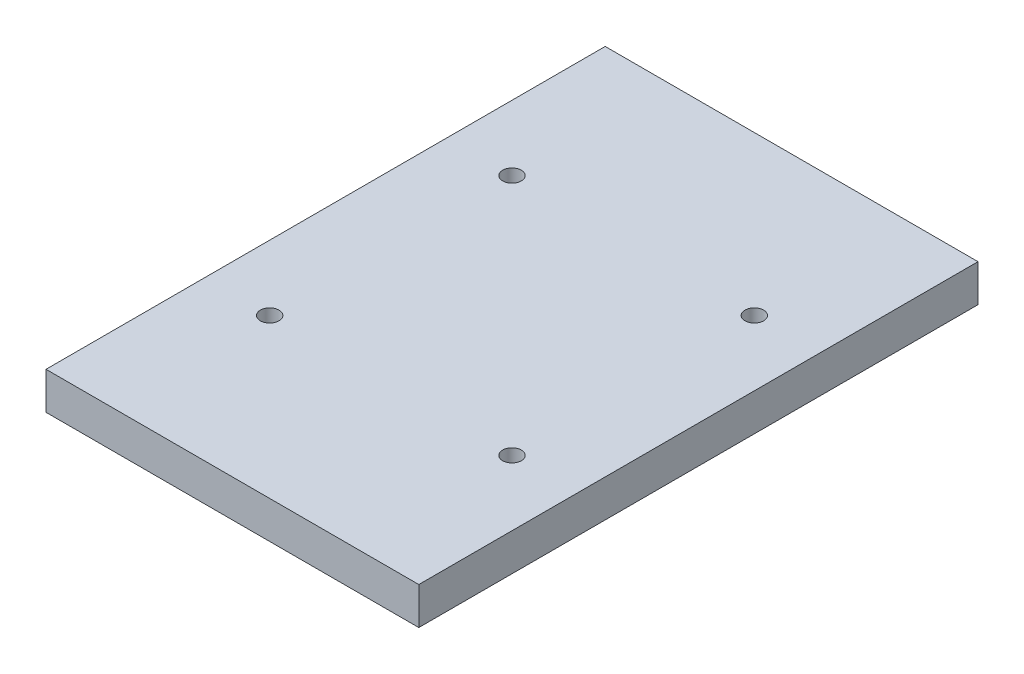
ISO-10303-21;
HEADER;
FILE_DESCRIPTION(('STEP AP214'),'2;1');
FILE_NAME('part.step','',(''),(''),'','','');
FILE_SCHEMA(('AUTOMOTIVE_DESIGN { 1 0 10303 214 1 1 1 1 }'));
ENDSEC;
DATA;
#1=APPLICATION_CONTEXT('core data for automotive mechanical design processes');
#2=APPLICATION_PROTOCOL_DEFINITION('international standard','automotive_design',2000,#1);
#3=PRODUCT_CONTEXT('',#1,'mechanical');
#4=PRODUCT('Part','Part','',(#3));
#5=PRODUCT_RELATED_PRODUCT_CATEGORY('part','',(#4));
#6=PRODUCT_DEFINITION_FORMATION('','',#4);
#7=PRODUCT_DEFINITION_CONTEXT('part definition',#1,'design');
#8=PRODUCT_DEFINITION('design','',#6,#7);
#9=PRODUCT_DEFINITION_SHAPE('','',#8);
#10=(LENGTH_UNIT() NAMED_UNIT(*) SI_UNIT(.MILLI.,.METRE.));
#11=(NAMED_UNIT(*) PLANE_ANGLE_UNIT() SI_UNIT($,.RADIAN.));
#12=(NAMED_UNIT(*) SI_UNIT($,.STERADIAN.) SOLID_ANGLE_UNIT());
#13=UNCERTAINTY_MEASURE_WITH_UNIT(LENGTH_MEASURE(1.E-05),#10,'distance_accuracy_value','');
#14=(GEOMETRIC_REPRESENTATION_CONTEXT(3) GLOBAL_UNCERTAINTY_ASSIGNED_CONTEXT((#13)) GLOBAL_UNIT_ASSIGNED_CONTEXT((#10,
#11,#12)) REPRESENTATION_CONTEXT('',''));
#15=CARTESIAN_POINT('',(0.,0.,0.));
#16=DIRECTION('',(0.,0.,1.));
#17=DIRECTION('',(1.,0.,0.));
#18=AXIS2_PLACEMENT_3D('',#15,#16,#17);
#19=CARTESIAN_POINT('',(0.,-120.,0.));
#20=DIRECTION('',(0.,1.,0.));
#21=DIRECTION('',(0.,0.,1.));
#22=AXIS2_PLACEMENT_3D('',#19,#20,#21);
#23=PLANE('',#22);
#24=CARTESIAN_POINT('',(462.5,-120.,-242.5));
#25=DIRECTION('',(0.,1.,0.));
#26=DIRECTION('',(0.,0.,1.));
#27=AXIS2_PLACEMENT_3D('',#24,#25,#26);
#28=CIRCLE('',#27,2.5);
#29=CARTESIAN_POINT('',(462.5,-120.,-240.));
#30=VERTEX_POINT('',#29);
#31=EDGE_CURVE('E136',#30,#30,#28,.T.);
#32=ORIENTED_EDGE('',*,*,#31,.F.);
#33=EDGE_LOOP('',(#32));
#34=FACE_BOUND('',#33,.T.);
#35=CARTESIAN_POINT('',(397.5,-120.,-242.5));
#36=DIRECTION('',(0.,1.,0.));
#37=DIRECTION('',(0.,0.,1.));
#38=AXIS2_PLACEMENT_3D('',#35,#36,#37);
#39=CIRCLE('',#38,2.5);
#40=CARTESIAN_POINT('',(397.5,-120.,-240.));
#41=VERTEX_POINT('',#40);
#42=EDGE_CURVE('E130',#41,#41,#39,.T.);
#43=ORIENTED_EDGE('',*,*,#42,.F.);
#44=EDGE_LOOP('',(#43));
#45=FACE_BOUND('',#44,.T.);
#46=CARTESIAN_POINT('',(397.5,-120.,-177.5));
#47=DIRECTION('',(0.,1.,0.));
#48=DIRECTION('',(0.,0.,1.));
#49=AXIS2_PLACEMENT_3D('',#46,#47,#48);
#50=CIRCLE('',#49,2.5);
#51=CARTESIAN_POINT('',(397.5,-120.,-175.));
#52=VERTEX_POINT('',#51);
#53=EDGE_CURVE('E124',#52,#52,#50,.T.);
#54=ORIENTED_EDGE('',*,*,#53,.F.);
#55=EDGE_LOOP('',(#54));
#56=FACE_BOUND('',#55,.T.);
#57=CARTESIAN_POINT('',(462.5,-120.,-177.5));
#58=DIRECTION('',(0.,1.,0.));
#59=DIRECTION('',(0.,0.,1.));
#60=AXIS2_PLACEMENT_3D('',#57,#58,#59);
#61=CIRCLE('',#60,2.5);
#62=CARTESIAN_POINT('',(462.5,-120.,-175.));
#63=VERTEX_POINT('',#62);
#64=EDGE_CURVE('E109',#63,#63,#61,.T.);
#65=ORIENTED_EDGE('',*,*,#64,.F.);
#66=EDGE_LOOP('',(#65));
#67=FACE_BOUND('',#66,.T.);
#68=DIRECTION('',(0.,0.,-1.));
#69=VECTOR('',#68,1.);
#70=CARTESIAN_POINT('',(380.,-120.,-285.));
#71=LINE('',#70,#69);
#72=CARTESIAN_POINT('',(380.,-120.,-135.));
#73=VERTEX_POINT('',#72);
#74=CARTESIAN_POINT('',(380.,-120.,-285.));
#75=VERTEX_POINT('',#74);
#76=EDGE_CURVE('E106',#73,#75,#71,.T.);
#77=ORIENTED_EDGE('',*,*,#76,.F.);
#78=DIRECTION('',(-1.,0.,0.));
#79=VECTOR('',#78,1.);
#80=CARTESIAN_POINT('',(380.,-120.,-135.));
#81=LINE('',#80,#79);
#82=CARTESIAN_POINT('',(480.,-120.,-135.));
#83=VERTEX_POINT('',#82);
#84=EDGE_CURVE('E82',#83,#73,#81,.T.);
#85=ORIENTED_EDGE('',*,*,#84,.F.);
#86=DIRECTION('',(0.,0.,1.));
#87=VECTOR('',#86,1.);
#88=CARTESIAN_POINT('',(480.,-120.,-285.));
#89=LINE('',#88,#87);
#90=CARTESIAN_POINT('',(480.,-120.,-285.));
#91=VERTEX_POINT('',#90);
#92=EDGE_CURVE('E76',#91,#83,#89,.T.);
#93=ORIENTED_EDGE('',*,*,#92,.F.);
#94=DIRECTION('',(1.,0.,0.));
#95=VECTOR('',#94,1.);
#96=CARTESIAN_POINT('',(380.,-120.,-285.));
#97=LINE('',#96,#95);
#98=EDGE_CURVE('E98',#75,#91,#97,.T.);
#99=ORIENTED_EDGE('',*,*,#98,.F.);
#100=EDGE_LOOP('',(#77,#85,#93,#99));
#101=FACE_BOUND('',#100,.T.);
#102=ADVANCED_FACE('F42',(#34,#45,#56,#67,#101),#23,.T.);
#103=CARTESIAN_POINT('',(380.,-130.,-135.));
#104=DIRECTION('',(0.,0.,-1.));
#105=DIRECTION('',(0.,1.,0.));
#106=AXIS2_PLACEMENT_3D('',#103,#104,#105);
#107=PLANE('',#106);
#108=ORIENTED_EDGE('',*,*,#84,.T.);
#109=DIRECTION('',(0.,1.,0.));
#110=VECTOR('',#109,1.);
#111=CARTESIAN_POINT('',(380.,-130.,-135.));
#112=LINE('',#111,#110);
#113=CARTESIAN_POINT('',(380.,-130.,-135.));
#114=VERTEX_POINT('',#113);
#115=EDGE_CURVE('E102',#114,#73,#112,.T.);
#116=ORIENTED_EDGE('',*,*,#115,.F.);
#117=DIRECTION('',(-1.,0.,0.));
#118=VECTOR('',#117,1.);
#119=CARTESIAN_POINT('',(380.,-130.,-135.));
#120=LINE('',#119,#118);
#121=CARTESIAN_POINT('',(480.,-130.,-135.));
#122=VERTEX_POINT('',#121);
#123=EDGE_CURVE('E59',#122,#114,#120,.T.);
#124=ORIENTED_EDGE('',*,*,#123,.F.);
#125=DIRECTION('',(0.,1.,0.));
#126=VECTOR('',#125,1.);
#127=CARTESIAN_POINT('',(480.,-130.,-135.));
#128=LINE('',#127,#126);
#129=EDGE_CURVE('E99',#122,#83,#128,.T.);
#130=ORIENTED_EDGE('',*,*,#129,.T.);
#131=EDGE_LOOP('',(#108,#116,#124,#130));
#132=FACE_BOUND('',#131,.T.);
#133=ADVANCED_FACE('F114',(#132),#107,.F.);
#134=CARTESIAN_POINT('',(380.,-130.,-285.));
#135=DIRECTION('',(1.,0.,0.));
#136=DIRECTION('',(0.,0.,-1.));
#137=AXIS2_PLACEMENT_3D('',#134,#135,#136);
#138=PLANE('',#137);
#139=ORIENTED_EDGE('',*,*,#76,.T.);
#140=DIRECTION('',(0.,1.,0.));
#141=VECTOR('',#140,1.);
#142=CARTESIAN_POINT('',(380.,-130.,-285.));
#143=LINE('',#142,#141);
#144=CARTESIAN_POINT('',(380.,-130.,-285.));
#145=VERTEX_POINT('',#144);
#146=EDGE_CURVE('E11',#145,#75,#143,.T.);
#147=ORIENTED_EDGE('',*,*,#146,.F.);
#148=DIRECTION('',(0.,0.,-1.));
#149=VECTOR('',#148,1.);
#150=CARTESIAN_POINT('',(380.,-130.,-285.));
#151=LINE('',#150,#149);
#152=EDGE_CURVE('E94',#114,#145,#151,.T.);
#153=ORIENTED_EDGE('',*,*,#152,.F.);
#154=ORIENTED_EDGE('',*,*,#115,.T.);
#155=EDGE_LOOP('',(#139,#147,#153,#154));
#156=FACE_BOUND('',#155,.T.);
#157=ADVANCED_FACE('F44',(#156),#138,.F.);
#158=CARTESIAN_POINT('',(0.,-130.,0.));
#159=DIRECTION('',(0.,1.,0.));
#160=DIRECTION('',(0.,0.,1.));
#161=AXIS2_PLACEMENT_3D('',#158,#159,#160);
#162=PLANE('',#161);
#163=CARTESIAN_POINT('',(462.5,-130.,-242.5));
#164=DIRECTION('',(0.,-1.,0.));
#165=DIRECTION('',(0.,0.,-1.));
#166=AXIS2_PLACEMENT_3D('',#163,#164,#165);
#167=CIRCLE('',#166,2.5);
#168=CARTESIAN_POINT('',(462.5,-130.,-245.));
#169=VERTEX_POINT('',#168);
#170=EDGE_CURVE('E139',#169,#169,#167,.T.);
#171=ORIENTED_EDGE('',*,*,#170,.F.);
#172=EDGE_LOOP('',(#171));
#173=FACE_BOUND('',#172,.T.);
#174=CARTESIAN_POINT('',(397.5,-130.,-242.5));
#175=DIRECTION('',(0.,-1.,0.));
#176=DIRECTION('',(0.,0.,-1.));
#177=AXIS2_PLACEMENT_3D('',#174,#175,#176);
#178=CIRCLE('',#177,2.5);
#179=CARTESIAN_POINT('',(397.5,-130.,-245.));
#180=VERTEX_POINT('',#179);
#181=EDGE_CURVE('E133',#180,#180,#178,.T.);
#182=ORIENTED_EDGE('',*,*,#181,.F.);
#183=EDGE_LOOP('',(#182));
#184=FACE_BOUND('',#183,.T.);
#185=CARTESIAN_POINT('',(397.5,-130.,-177.5));
#186=DIRECTION('',(0.,-1.,0.));
#187=DIRECTION('',(0.,0.,-1.));
#188=AXIS2_PLACEMENT_3D('',#185,#186,#187);
#189=CIRCLE('',#188,2.5);
#190=CARTESIAN_POINT('',(397.5,-130.,-180.));
#191=VERTEX_POINT('',#190);
#192=EDGE_CURVE('E127',#191,#191,#189,.T.);
#193=ORIENTED_EDGE('',*,*,#192,.F.);
#194=EDGE_LOOP('',(#193));
#195=FACE_BOUND('',#194,.T.);
#196=CARTESIAN_POINT('',(462.5,-130.,-177.5));
#197=DIRECTION('',(0.,-1.,0.));
#198=DIRECTION('',(0.,0.,-1.));
#199=AXIS2_PLACEMENT_3D('',#196,#197,#198);
#200=CIRCLE('',#199,2.5);
#201=CARTESIAN_POINT('',(462.5,-130.,-180.));
#202=VERTEX_POINT('',#201);
#203=EDGE_CURVE('E121',#202,#202,#200,.T.);
#204=ORIENTED_EDGE('',*,*,#203,.F.);
#205=EDGE_LOOP('',(#204));
#206=FACE_BOUND('',#205,.T.);
#207=ORIENTED_EDGE('',*,*,#152,.T.);
#208=DIRECTION('',(1.,0.,0.));
#209=VECTOR('',#208,1.);
#210=CARTESIAN_POINT('',(380.,-130.,-285.));
#211=LINE('',#210,#209);
#212=CARTESIAN_POINT('',(480.,-130.,-285.));
#213=VERTEX_POINT('',#212);
#214=EDGE_CURVE('E89',#145,#213,#211,.T.);
#215=ORIENTED_EDGE('',*,*,#214,.T.);
#216=DIRECTION('',(0.,0.,1.));
#217=VECTOR('',#216,1.);
#218=CARTESIAN_POINT('',(480.,-130.,-285.));
#219=LINE('',#218,#217);
#220=EDGE_CURVE('E92',#213,#122,#219,.T.);
#221=ORIENTED_EDGE('',*,*,#220,.T.);
#222=ORIENTED_EDGE('',*,*,#123,.T.);
#223=EDGE_LOOP('',(#207,#215,#221,#222));
#224=FACE_BOUND('',#223,.T.);
#225=ADVANCED_FACE('F90',(#173,#184,#195,#206,#224),#162,.F.);
#226=CARTESIAN_POINT('',(480.,-130.,-285.));
#227=DIRECTION('',(-1.,0.,0.));
#228=DIRECTION('',(0.,0.,1.));
#229=AXIS2_PLACEMENT_3D('',#226,#227,#228);
#230=PLANE('',#229);
#231=ORIENTED_EDGE('',*,*,#92,.T.);
#232=ORIENTED_EDGE('',*,*,#129,.F.);
#233=ORIENTED_EDGE('',*,*,#220,.F.);
#234=DIRECTION('',(0.,1.,0.));
#235=VECTOR('',#234,1.);
#236=CARTESIAN_POINT('',(480.,-130.,-285.));
#237=LINE('',#236,#235);
#238=EDGE_CURVE('E51',#213,#91,#237,.T.);
#239=ORIENTED_EDGE('',*,*,#238,.T.);
#240=EDGE_LOOP('',(#231,#232,#233,#239));
#241=FACE_BOUND('',#240,.T.);
#242=ADVANCED_FACE('F100',(#241),#230,.F.);
#243=CARTESIAN_POINT('',(380.,-130.,-285.));
#244=DIRECTION('',(0.,0.,1.));
#245=DIRECTION('',(1.,0.,0.));
#246=AXIS2_PLACEMENT_3D('',#243,#244,#245);
#247=PLANE('',#246);
#248=ORIENTED_EDGE('',*,*,#98,.T.);
#249=ORIENTED_EDGE('',*,*,#238,.F.);
#250=ORIENTED_EDGE('',*,*,#214,.F.);
#251=ORIENTED_EDGE('',*,*,#146,.T.);
#252=EDGE_LOOP('',(#248,#249,#250,#251));
#253=FACE_BOUND('',#252,.T.);
#254=ADVANCED_FACE('F97',(#253),#247,.F.);
#255=CARTESIAN_POINT('',(462.5,-130.,-177.5));
#256=DIRECTION('',(0.,-1.,0.));
#257=DIRECTION('',(0.,0.,-1.));
#258=AXIS2_PLACEMENT_3D('',#255,#256,#257);
#259=CYLINDRICAL_SURFACE('',#258,2.5);
#260=ORIENTED_EDGE('',*,*,#203,.T.);
#261=EDGE_LOOP('',(#260));
#262=FACE_BOUND('',#261,.T.);
#263=ORIENTED_EDGE('',*,*,#64,.T.);
#264=EDGE_LOOP('',(#263));
#265=FACE_BOUND('',#264,.T.);
#266=ADVANCED_FACE('F155',(#262,#265),#259,.F.);
#267=CARTESIAN_POINT('',(397.5,-130.,-177.5));
#268=DIRECTION('',(0.,-1.,0.));
#269=DIRECTION('',(0.,0.,-1.));
#270=AXIS2_PLACEMENT_3D('',#267,#268,#269);
#271=CYLINDRICAL_SURFACE('',#270,2.5);
#272=ORIENTED_EDGE('',*,*,#192,.T.);
#273=EDGE_LOOP('',(#272));
#274=FACE_BOUND('',#273,.T.);
#275=ORIENTED_EDGE('',*,*,#53,.T.);
#276=EDGE_LOOP('',(#275));
#277=FACE_BOUND('',#276,.T.);
#278=ADVANCED_FACE('F158',(#274,#277),#271,.F.);
#279=CARTESIAN_POINT('',(397.5,-130.,-242.5));
#280=DIRECTION('',(0.,-1.,0.));
#281=DIRECTION('',(0.,0.,-1.));
#282=AXIS2_PLACEMENT_3D('',#279,#280,#281);
#283=CYLINDRICAL_SURFACE('',#282,2.5);
#284=ORIENTED_EDGE('',*,*,#181,.T.);
#285=EDGE_LOOP('',(#284));
#286=FACE_BOUND('',#285,.T.);
#287=ORIENTED_EDGE('',*,*,#42,.T.);
#288=EDGE_LOOP('',(#287));
#289=FACE_BOUND('',#288,.T.);
#290=ADVANCED_FACE('F172',(#286,#289),#283,.F.);
#291=CARTESIAN_POINT('',(462.5,-130.,-242.5));
#292=DIRECTION('',(0.,-1.,0.));
#293=DIRECTION('',(0.,0.,-1.));
#294=AXIS2_PLACEMENT_3D('',#291,#292,#293);
#295=CYLINDRICAL_SURFACE('',#294,2.5);
#296=ORIENTED_EDGE('',*,*,#170,.T.);
#297=EDGE_LOOP('',(#296));
#298=FACE_BOUND('',#297,.T.);
#299=ORIENTED_EDGE('',*,*,#31,.T.);
#300=EDGE_LOOP('',(#299));
#301=FACE_BOUND('',#300,.T.);
#302=ADVANCED_FACE('F143',(#298,#301),#295,.F.);
#303=CLOSED_SHELL('',(#102,#133,#157,#225,#242,#254,#266,#278,#290,#302));
#304=MANIFOLD_SOLID_BREP('B2',#303);
#305=ADVANCED_BREP_SHAPE_REPRESENTATION('',(#18,#304),#14);
#306=SHAPE_DEFINITION_REPRESENTATION(#9,#305);
ENDSEC;
END-ISO-10303-21;
